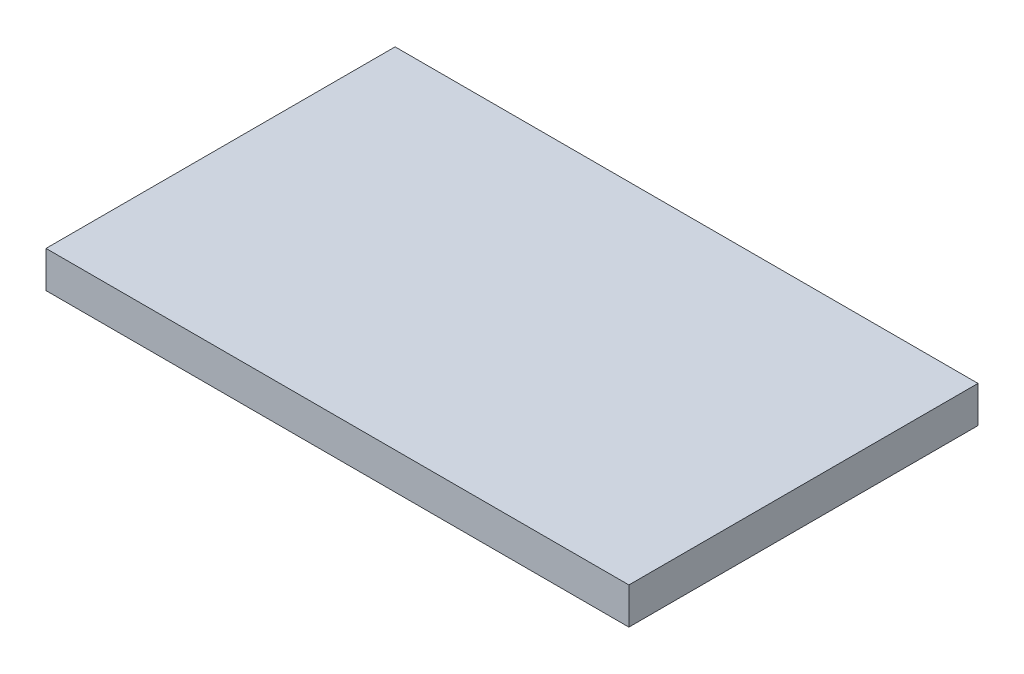
ISO-10303-21;
HEADER;
FILE_DESCRIPTION(('STEP AP214'),'2;1');
FILE_NAME('part.step','',(''),(''),'','','');
FILE_SCHEMA(('AUTOMOTIVE_DESIGN { 1 0 10303 214 1 1 1 1 }'));
ENDSEC;
DATA;
#1=APPLICATION_CONTEXT('core data for automotive mechanical design processes');
#2=APPLICATION_PROTOCOL_DEFINITION('international standard','automotive_design',2000,#1);
#3=PRODUCT_CONTEXT('',#1,'mechanical');
#4=PRODUCT('Part','Part','',(#3));
#5=PRODUCT_RELATED_PRODUCT_CATEGORY('part','',(#4));
#6=PRODUCT_DEFINITION_FORMATION('','',#4);
#7=PRODUCT_DEFINITION_CONTEXT('part definition',#1,'design');
#8=PRODUCT_DEFINITION('design','',#6,#7);
#9=PRODUCT_DEFINITION_SHAPE('','',#8);
#10=(LENGTH_UNIT() NAMED_UNIT(*) SI_UNIT(.MILLI.,.METRE.));
#11=(NAMED_UNIT(*) PLANE_ANGLE_UNIT() SI_UNIT($,.RADIAN.));
#12=(NAMED_UNIT(*) SI_UNIT($,.STERADIAN.) SOLID_ANGLE_UNIT());
#13=UNCERTAINTY_MEASURE_WITH_UNIT(LENGTH_MEASURE(1.E-05),#10,'distance_accuracy_value','');
#14=(GEOMETRIC_REPRESENTATION_CONTEXT(3) GLOBAL_UNCERTAINTY_ASSIGNED_CONTEXT((#13)) GLOBAL_UNIT_ASSIGNED_CONTEXT((#10,
#11,#12)) REPRESENTATION_CONTEXT('',''));
#15=CARTESIAN_POINT('',(0.,0.,0.));
#16=DIRECTION('',(0.,0.,1.));
#17=DIRECTION('',(1.,0.,0.));
#18=AXIS2_PLACEMENT_3D('',#15,#16,#17);
#19=CARTESIAN_POINT('',(0.,2.54,0.));
#20=DIRECTION('',(1.,0.,0.));
#21=DIRECTION('',(0.,0.,-1.));
#22=AXIS2_PLACEMENT_3D('',#19,#20,#21);
#23=PLANE('',#22);
#24=DIRECTION('',(0.,0.,1.));
#25=VECTOR('',#24,1.);
#26=CARTESIAN_POINT('',(0.,0.,0.));
#27=LINE('',#26,#25);
#28=CARTESIAN_POINT('',(0.,0.,-24.25142510248));
#29=VERTEX_POINT('',#28);
#30=CARTESIAN_POINT('',(0.,0.,0.));
#31=VERTEX_POINT('',#30);
#32=EDGE_CURVE('E113',#29,#31,#27,.T.);
#33=ORIENTED_EDGE('',*,*,#32,.T.);
#34=DIRECTION('',(0.,-1.,0.));
#35=VECTOR('',#34,1.);
#36=CARTESIAN_POINT('',(0.,2.54,0.));
#37=LINE('',#36,#35);
#38=CARTESIAN_POINT('',(0.,2.54,0.));
#39=VERTEX_POINT('',#38);
#40=EDGE_CURVE('E11',#39,#31,#37,.T.);
#41=ORIENTED_EDGE('',*,*,#40,.F.);
#42=DIRECTION('',(0.,0.,1.));
#43=VECTOR('',#42,1.);
#44=CARTESIAN_POINT('',(0.,2.54,0.));
#45=LINE('',#44,#43);
#46=CARTESIAN_POINT('',(0.,2.54,-24.25142510248));
#47=VERTEX_POINT('',#46);
#48=EDGE_CURVE('E97',#47,#39,#45,.T.);
#49=ORIENTED_EDGE('',*,*,#48,.F.);
#50=DIRECTION('',(0.,-1.,0.));
#51=VECTOR('',#50,1.);
#52=CARTESIAN_POINT('',(0.,2.54,-24.25142510248));
#53=LINE('',#52,#51);
#54=EDGE_CURVE('E109',#47,#29,#53,.T.);
#55=ORIENTED_EDGE('',*,*,#54,.T.);
#56=EDGE_LOOP('',(#33,#41,#49,#55));
#57=FACE_BOUND('',#56,.T.);
#58=ADVANCED_FACE('F45',(#57),#23,.F.);
#59=CARTESIAN_POINT('',(0.,2.54,0.));
#60=DIRECTION('',(0.,0.,-1.));
#61=DIRECTION('',(-1.,0.,0.));
#62=AXIS2_PLACEMENT_3D('',#59,#60,#61);
#63=PLANE('',#62);
#64=DIRECTION('',(1.,0.,0.));
#65=VECTOR('',#64,1.);
#66=CARTESIAN_POINT('',(0.,0.,0.));
#67=LINE('',#66,#65);
#68=CARTESIAN_POINT('',(40.4938919149434,0.,0.));
#69=VERTEX_POINT('',#68);
#70=EDGE_CURVE('E102',#31,#69,#67,.T.);
#71=ORIENTED_EDGE('',*,*,#70,.T.);
#72=DIRECTION('',(0.,-1.,0.));
#73=VECTOR('',#72,1.);
#74=CARTESIAN_POINT('',(40.4938919149434,2.54,0.));
#75=LINE('',#74,#73);
#76=CARTESIAN_POINT('',(40.4938919149434,2.54,0.));
#77=VERTEX_POINT('',#76);
#78=EDGE_CURVE('E54',#77,#69,#75,.T.);
#79=ORIENTED_EDGE('',*,*,#78,.F.);
#80=DIRECTION('',(1.,0.,0.));
#81=VECTOR('',#80,1.);
#82=CARTESIAN_POINT('',(0.,2.54,0.));
#83=LINE('',#82,#81);
#84=EDGE_CURVE('E92',#39,#77,#83,.T.);
#85=ORIENTED_EDGE('',*,*,#84,.F.);
#86=ORIENTED_EDGE('',*,*,#40,.T.);
#87=EDGE_LOOP('',(#71,#79,#85,#86));
#88=FACE_BOUND('',#87,.T.);
#89=ADVANCED_FACE('F101',(#88),#63,.F.);
#90=CARTESIAN_POINT('',(40.4938919149434,2.54,0.));
#91=DIRECTION('',(-1.,0.,0.));
#92=DIRECTION('',(0.,0.,1.));
#93=AXIS2_PLACEMENT_3D('',#90,#91,#92);
#94=PLANE('',#93);
#95=DIRECTION('',(0.,0.,-1.));
#96=VECTOR('',#95,1.);
#97=CARTESIAN_POINT('',(40.4938919149434,0.,0.));
#98=LINE('',#97,#96);
#99=CARTESIAN_POINT('',(40.4938919149434,0.,-24.25142510248));
#100=VERTEX_POINT('',#99);
#101=EDGE_CURVE('E79',#69,#100,#98,.T.);
#102=ORIENTED_EDGE('',*,*,#101,.T.);
#103=DIRECTION('',(0.,-1.,0.));
#104=VECTOR('',#103,1.);
#105=CARTESIAN_POINT('',(40.4938919149434,2.54,-24.25142510248));
#106=LINE('',#105,#104);
#107=CARTESIAN_POINT('',(40.4938919149434,2.54,-24.25142510248));
#108=VERTEX_POINT('',#107);
#109=EDGE_CURVE('E104',#108,#100,#106,.T.);
#110=ORIENTED_EDGE('',*,*,#109,.F.);
#111=DIRECTION('',(0.,0.,-1.));
#112=VECTOR('',#111,1.);
#113=CARTESIAN_POINT('',(40.4938919149434,2.54,0.));
#114=LINE('',#113,#112);
#115=EDGE_CURVE('E95',#77,#108,#114,.T.);
#116=ORIENTED_EDGE('',*,*,#115,.F.);
#117=ORIENTED_EDGE('',*,*,#78,.T.);
#118=EDGE_LOOP('',(#102,#110,#116,#117));
#119=FACE_BOUND('',#118,.T.);
#120=ADVANCED_FACE('F105',(#119),#94,.F.);
#121=CARTESIAN_POINT('',(0.,2.54,-24.25142510248));
#122=DIRECTION('',(0.,0.,1.));
#123=DIRECTION('',(1.,0.,0.));
#124=AXIS2_PLACEMENT_3D('',#121,#122,#123);
#125=PLANE('',#124);
#126=DIRECTION('',(-1.,0.,0.));
#127=VECTOR('',#126,1.);
#128=CARTESIAN_POINT('',(0.,0.,-24.25142510248));
#129=LINE('',#128,#127);
#130=EDGE_CURVE('E85',#100,#29,#129,.T.);
#131=ORIENTED_EDGE('',*,*,#130,.T.);
#132=ORIENTED_EDGE('',*,*,#54,.F.);
#133=DIRECTION('',(-1.,0.,0.));
#134=VECTOR('',#133,1.);
#135=CARTESIAN_POINT('',(0.,2.54,-24.25142510248));
#136=LINE('',#135,#134);
#137=EDGE_CURVE('E62',#108,#47,#136,.T.);
#138=ORIENTED_EDGE('',*,*,#137,.F.);
#139=ORIENTED_EDGE('',*,*,#109,.T.);
#140=EDGE_LOOP('',(#131,#132,#138,#139));
#141=FACE_BOUND('',#140,.T.);
#142=ADVANCED_FACE('F126',(#141),#125,.F.);
#143=CARTESIAN_POINT('',(0.,2.54,0.));
#144=DIRECTION('',(0.,-1.,0.));
#145=DIRECTION('',(0.,0.,-1.));
#146=AXIS2_PLACEMENT_3D('',#143,#144,#145);
#147=PLANE('',#146);
#148=ORIENTED_EDGE('',*,*,#48,.T.);
#149=ORIENTED_EDGE('',*,*,#84,.T.);
#150=ORIENTED_EDGE('',*,*,#115,.T.);
#151=ORIENTED_EDGE('',*,*,#137,.T.);
#152=EDGE_LOOP('',(#148,#149,#150,#151));
#153=FACE_BOUND('',#152,.T.);
#154=ADVANCED_FACE('F93',(#153),#147,.F.);
#155=CARTESIAN_POINT('',(0.,0.,0.));
#156=DIRECTION('',(0.,-1.,0.));
#157=DIRECTION('',(0.,0.,-1.));
#158=AXIS2_PLACEMENT_3D('',#155,#156,#157);
#159=PLANE('',#158);
#160=ORIENTED_EDGE('',*,*,#32,.F.);
#161=ORIENTED_EDGE('',*,*,#130,.F.);
#162=ORIENTED_EDGE('',*,*,#101,.F.);
#163=ORIENTED_EDGE('',*,*,#70,.F.);
#164=EDGE_LOOP('',(#160,#161,#162,#163));
#165=FACE_BOUND('',#164,.T.);
#166=ADVANCED_FACE('F129',(#165),#159,.T.);
#167=CLOSED_SHELL('',(#58,#89,#120,#142,#154,#166));
#168=MANIFOLD_SOLID_BREP('B2',#167);
#169=ADVANCED_BREP_SHAPE_REPRESENTATION('',(#18,#168),#14);
#170=SHAPE_DEFINITION_REPRESENTATION(#9,#169);
ENDSEC;
END-ISO-10303-21;
